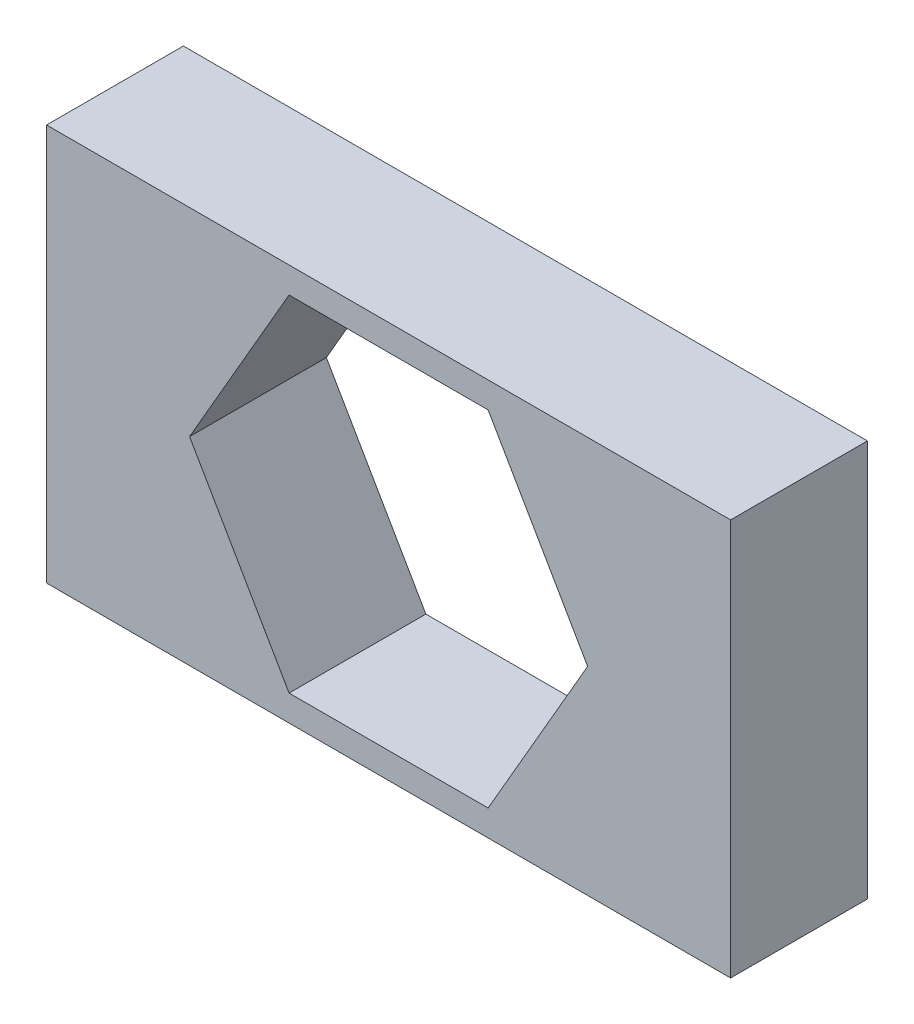
ISO-10303-21;
HEADER;
FILE_DESCRIPTION(('STEP AP214'),'2;1');
FILE_NAME('part.step','',(''),(''),'','','');
FILE_SCHEMA(('AUTOMOTIVE_DESIGN { 1 0 10303 214 1 1 1 1 }'));
ENDSEC;
DATA;
#1=APPLICATION_CONTEXT('core data for automotive mechanical design processes');
#2=APPLICATION_PROTOCOL_DEFINITION('international standard','automotive_design',2000,#1);
#3=PRODUCT_CONTEXT('',#1,'mechanical');
#4=PRODUCT('Part','Part','',(#3));
#5=PRODUCT_RELATED_PRODUCT_CATEGORY('part','',(#4));
#6=PRODUCT_DEFINITION_FORMATION('','',#4);
#7=PRODUCT_DEFINITION_CONTEXT('part definition',#1,'design');
#8=PRODUCT_DEFINITION('design','',#6,#7);
#9=PRODUCT_DEFINITION_SHAPE('','',#8);
#10=(LENGTH_UNIT() NAMED_UNIT(*) SI_UNIT(.MILLI.,.METRE.));
#11=(NAMED_UNIT(*) PLANE_ANGLE_UNIT() SI_UNIT($,.RADIAN.));
#12=(NAMED_UNIT(*) SI_UNIT($,.STERADIAN.) SOLID_ANGLE_UNIT());
#13=UNCERTAINTY_MEASURE_WITH_UNIT(LENGTH_MEASURE(1.E-05),#10,'distance_accuracy_value','');
#14=(GEOMETRIC_REPRESENTATION_CONTEXT(3) GLOBAL_UNCERTAINTY_ASSIGNED_CONTEXT((#13)) GLOBAL_UNIT_ASSIGNED_CONTEXT((#10,
#11,#12)) REPRESENTATION_CONTEXT('',''));
#15=CARTESIAN_POINT('',(0.,0.,0.));
#16=DIRECTION('',(0.,0.,1.));
#17=DIRECTION('',(1.,0.,0.));
#18=AXIS2_PLACEMENT_3D('',#15,#16,#17);
#19=CARTESIAN_POINT('',(0.,0.,5.));
#20=DIRECTION('',(0.,0.,-1.));
#21=DIRECTION('',(-1.,0.,0.));
#22=AXIS2_PLACEMENT_3D('',#19,#20,#21);
#23=PLANE('',#22);
#24=DIRECTION('',(0.,-1.,0.));
#25=VECTOR('',#24,1.);
#26=CARTESIAN_POINT('',(0.,0.,5.));
#27=LINE('',#26,#25);
#28=CARTESIAN_POINT('',(0.,14.5,5.));
#29=VERTEX_POINT('',#28);
#30=CARTESIAN_POINT('',(0.,0.,5.));
#31=VERTEX_POINT('',#30);
#32=EDGE_CURVE('E160',#29,#31,#27,.T.);
#33=ORIENTED_EDGE('',*,*,#32,.T.);
#34=DIRECTION('',(1.,0.,0.));
#35=VECTOR('',#34,1.);
#36=CARTESIAN_POINT('',(0.,0.,5.));
#37=LINE('',#36,#35);
#38=CARTESIAN_POINT('',(25.,0.,5.));
#39=VERTEX_POINT('',#38);
#40=EDGE_CURVE('E163',#31,#39,#37,.T.);
#41=ORIENTED_EDGE('',*,*,#40,.T.);
#42=DIRECTION('',(0.,1.,0.));
#43=VECTOR('',#42,1.);
#44=CARTESIAN_POINT('',(25.,0.,5.));
#45=LINE('',#44,#43);
#46=CARTESIAN_POINT('',(25.,14.5,5.));
#47=VERTEX_POINT('',#46);
#48=EDGE_CURVE('E166',#39,#47,#45,.T.);
#49=ORIENTED_EDGE('',*,*,#48,.T.);
#50=DIRECTION('',(-1.,0.,0.));
#51=VECTOR('',#50,1.);
#52=CARTESIAN_POINT('',(0.,14.5,5.));
#53=LINE('',#52,#51);
#54=EDGE_CURVE('E168',#47,#29,#53,.T.);
#55=ORIENTED_EDGE('',*,*,#54,.T.);
#56=EDGE_LOOP('',(#33,#41,#49,#55));
#57=FACE_BOUND('',#56,.T.);
#58=DIRECTION('',(0.5,0.866025403784439,0.));
#59=VECTOR('',#58,1.);
#60=CARTESIAN_POINT('',(16.1373066958946,0.949999999999999,5.));
#61=LINE('',#60,#59);
#62=CARTESIAN_POINT('',(16.1373066958946,0.949999999999999,5.));
#63=VERTEX_POINT('',#62);
#64=CARTESIAN_POINT('',(19.7746133917893,7.25,5.));
#65=VERTEX_POINT('',#64);
#66=EDGE_CURVE('E109',#63,#65,#61,.T.);
#67=ORIENTED_EDGE('',*,*,#66,.F.);
#68=DIRECTION('',(1.,0.,0.));
#69=VECTOR('',#68,1.);
#70=CARTESIAN_POINT('',(8.86269330410535,0.950000000000003,5.));
#71=LINE('',#70,#69);
#72=CARTESIAN_POINT('',(8.86269330410535,0.950000000000003,5.));
#73=VERTEX_POINT('',#72);
#74=EDGE_CURVE('E138',#73,#63,#71,.T.);
#75=ORIENTED_EDGE('',*,*,#74,.F.);
#76=DIRECTION('',(0.5,-0.866025403784439,0.));
#77=VECTOR('',#76,1.);
#78=CARTESIAN_POINT('',(5.22538660821071,7.25000000000001,5.));
#79=LINE('',#78,#77);
#80=CARTESIAN_POINT('',(5.22538660821071,7.25000000000001,5.));
#81=VERTEX_POINT('',#80);
#82=EDGE_CURVE('E136',#81,#73,#79,.T.);
#83=ORIENTED_EDGE('',*,*,#82,.F.);
#84=DIRECTION('',(-0.5,-0.866025403784438,0.));
#85=VECTOR('',#84,1.);
#86=CARTESIAN_POINT('',(8.86269330410536,13.55,5.));
#87=LINE('',#86,#85);
#88=CARTESIAN_POINT('',(8.86269330410536,13.55,5.));
#89=VERTEX_POINT('',#88);
#90=EDGE_CURVE('E132',#89,#81,#87,.T.);
#91=ORIENTED_EDGE('',*,*,#90,.F.);
#92=DIRECTION('',(-1.,0.,0.));
#93=VECTOR('',#92,1.);
#94=CARTESIAN_POINT('',(16.1373066958946,13.55,5.));
#95=LINE('',#94,#93);
#96=CARTESIAN_POINT('',(16.1373066958946,13.55,5.));
#97=VERTEX_POINT('',#96);
#98=EDGE_CURVE('E130',#97,#89,#95,.T.);
#99=ORIENTED_EDGE('',*,*,#98,.F.);
#100=DIRECTION('',(-0.5,0.866025403784439,0.));
#101=VECTOR('',#100,1.);
#102=CARTESIAN_POINT('',(19.7746133917893,7.25,5.));
#103=LINE('',#102,#101);
#104=EDGE_CURVE('E117',#65,#97,#103,.T.);
#105=ORIENTED_EDGE('',*,*,#104,.F.);
#106=EDGE_LOOP('',(#67,#75,#83,#91,#99,#105));
#107=FACE_BOUND('',#106,.T.);
#108=ADVANCED_FACE('F32',(#57,#107),#23,.F.);
#109=CARTESIAN_POINT('',(0.,0.,0.));
#110=DIRECTION('',(0.,0.,-1.));
#111=DIRECTION('',(-1.,0.,0.));
#112=AXIS2_PLACEMENT_3D('',#109,#110,#111);
#113=PLANE('',#112);
#114=DIRECTION('',(0.,-1.,0.));
#115=VECTOR('',#114,1.);
#116=CARTESIAN_POINT('',(0.,0.,0.));
#117=LINE('',#116,#115);
#118=CARTESIAN_POINT('',(0.,14.5,0.));
#119=VERTEX_POINT('',#118);
#120=CARTESIAN_POINT('',(0.,0.,0.));
#121=VERTEX_POINT('',#120);
#122=EDGE_CURVE('E125',#119,#121,#117,.T.);
#123=ORIENTED_EDGE('',*,*,#122,.F.);
#124=DIRECTION('',(-1.,0.,0.));
#125=VECTOR('',#124,1.);
#126=CARTESIAN_POINT('',(0.,14.5,0.));
#127=LINE('',#126,#125);
#128=CARTESIAN_POINT('',(25.,14.5,0.));
#129=VERTEX_POINT('',#128);
#130=EDGE_CURVE('E164',#129,#119,#127,.T.);
#131=ORIENTED_EDGE('',*,*,#130,.F.);
#132=DIRECTION('',(0.,1.,0.));
#133=VECTOR('',#132,1.);
#134=CARTESIAN_POINT('',(25.,0.,0.));
#135=LINE('',#134,#133);
#136=CARTESIAN_POINT('',(25.,0.,0.));
#137=VERTEX_POINT('',#136);
#138=EDGE_CURVE('E175',#137,#129,#135,.T.);
#139=ORIENTED_EDGE('',*,*,#138,.F.);
#140=DIRECTION('',(1.,0.,0.));
#141=VECTOR('',#140,1.);
#142=CARTESIAN_POINT('',(0.,0.,0.));
#143=LINE('',#142,#141);
#144=EDGE_CURVE('E173',#121,#137,#143,.T.);
#145=ORIENTED_EDGE('',*,*,#144,.F.);
#146=EDGE_LOOP('',(#123,#131,#139,#145));
#147=FACE_BOUND('',#146,.T.);
#148=DIRECTION('',(1.,0.,0.));
#149=VECTOR('',#148,1.);
#150=CARTESIAN_POINT('',(8.86269330410535,0.950000000000003,0.));
#151=LINE('',#150,#149);
#152=CARTESIAN_POINT('',(8.86269330410535,0.950000000000003,0.));
#153=VERTEX_POINT('',#152);
#154=CARTESIAN_POINT('',(16.1373066958946,0.949999999999999,0.));
#155=VERTEX_POINT('',#154);
#156=EDGE_CURVE('E118',#153,#155,#151,.T.);
#157=ORIENTED_EDGE('',*,*,#156,.T.);
#158=DIRECTION('',(0.5,0.866025403784439,0.));
#159=VECTOR('',#158,1.);
#160=CARTESIAN_POINT('',(16.1373066958946,0.949999999999999,0.));
#161=LINE('',#160,#159);
#162=CARTESIAN_POINT('',(19.7746133917893,7.25,0.));
#163=VERTEX_POINT('',#162);
#164=EDGE_CURVE('E55',#155,#163,#161,.T.);
#165=ORIENTED_EDGE('',*,*,#164,.T.);
#166=DIRECTION('',(-0.5,0.866025403784439,0.));
#167=VECTOR('',#166,1.);
#168=CARTESIAN_POINT('',(19.7746133917893,7.25,0.));
#169=LINE('',#168,#167);
#170=CARTESIAN_POINT('',(16.1373066958946,13.55,0.));
#171=VERTEX_POINT('',#170);
#172=EDGE_CURVE('E124',#163,#171,#169,.T.);
#173=ORIENTED_EDGE('',*,*,#172,.T.);
#174=DIRECTION('',(-1.,0.,0.));
#175=VECTOR('',#174,1.);
#176=CARTESIAN_POINT('',(16.1373066958946,13.55,0.));
#177=LINE('',#176,#175);
#178=CARTESIAN_POINT('',(8.86269330410536,13.55,0.));
#179=VERTEX_POINT('',#178);
#180=EDGE_CURVE('E142',#171,#179,#177,.T.);
#181=ORIENTED_EDGE('',*,*,#180,.T.);
#182=DIRECTION('',(-0.5,-0.866025403784438,0.));
#183=VECTOR('',#182,1.);
#184=CARTESIAN_POINT('',(8.86269330410536,13.55,0.));
#185=LINE('',#184,#183);
#186=CARTESIAN_POINT('',(5.22538660821071,7.25000000000001,0.));
#187=VERTEX_POINT('',#186);
#188=EDGE_CURVE('E145',#179,#187,#185,.T.);
#189=ORIENTED_EDGE('',*,*,#188,.T.);
#190=DIRECTION('',(0.5,-0.866025403784439,0.));
#191=VECTOR('',#190,1.);
#192=CARTESIAN_POINT('',(5.22538660821071,7.25000000000001,0.));
#193=LINE('',#192,#191);
#194=EDGE_CURVE('E148',#187,#153,#193,.T.);
#195=ORIENTED_EDGE('',*,*,#194,.T.);
#196=EDGE_LOOP('',(#157,#165,#173,#181,#189,#195));
#197=FACE_BOUND('',#196,.T.);
#198=ADVANCED_FACE('F193',(#147,#197),#113,.T.);
#199=CARTESIAN_POINT('',(0.,0.,5.));
#200=DIRECTION('',(1.,0.,0.));
#201=DIRECTION('',(0.,1.,0.));
#202=AXIS2_PLACEMENT_3D('',#199,#200,#201);
#203=PLANE('',#202);
#204=ORIENTED_EDGE('',*,*,#122,.T.);
#205=DIRECTION('',(0.,0.,-1.));
#206=VECTOR('',#205,1.);
#207=CARTESIAN_POINT('',(0.,0.,5.));
#208=LINE('',#207,#206);
#209=EDGE_CURVE('E11',#31,#121,#208,.T.);
#210=ORIENTED_EDGE('',*,*,#209,.F.);
#211=ORIENTED_EDGE('',*,*,#32,.F.);
#212=DIRECTION('',(0.,0.,-1.));
#213=VECTOR('',#212,1.);
#214=CARTESIAN_POINT('',(0.,14.5,5.));
#215=LINE('',#214,#213);
#216=EDGE_CURVE('E170',#29,#119,#215,.T.);
#217=ORIENTED_EDGE('',*,*,#216,.T.);
#218=EDGE_LOOP('',(#204,#210,#211,#217));
#219=FACE_BOUND('',#218,.T.);
#220=ADVANCED_FACE('F34',(#219),#203,.F.);
#221=CARTESIAN_POINT('',(0.,0.,5.));
#222=DIRECTION('',(0.,1.,0.));
#223=DIRECTION('',(-1.,0.,0.));
#224=AXIS2_PLACEMENT_3D('',#221,#222,#223);
#225=PLANE('',#224);
#226=ORIENTED_EDGE('',*,*,#144,.T.);
#227=DIRECTION('',(0.,0.,-1.));
#228=VECTOR('',#227,1.);
#229=CARTESIAN_POINT('',(25.,0.,5.));
#230=LINE('',#229,#228);
#231=EDGE_CURVE('E40',#39,#137,#230,.T.);
#232=ORIENTED_EDGE('',*,*,#231,.F.);
#233=ORIENTED_EDGE('',*,*,#40,.F.);
#234=ORIENTED_EDGE('',*,*,#209,.T.);
#235=EDGE_LOOP('',(#226,#232,#233,#234));
#236=FACE_BOUND('',#235,.T.);
#237=ADVANCED_FACE('F203',(#236),#225,.F.);
#238=CARTESIAN_POINT('',(25.,0.,5.));
#239=DIRECTION('',(-1.,0.,0.));
#240=DIRECTION('',(0.,0.,1.));
#241=AXIS2_PLACEMENT_3D('',#238,#239,#240);
#242=PLANE('',#241);
#243=ORIENTED_EDGE('',*,*,#138,.T.);
#244=DIRECTION('',(0.,0.,-1.));
#245=VECTOR('',#244,1.);
#246=CARTESIAN_POINT('',(25.,14.5,5.));
#247=LINE('',#246,#245);
#248=EDGE_CURVE('E180',#47,#129,#247,.T.);
#249=ORIENTED_EDGE('',*,*,#248,.F.);
#250=ORIENTED_EDGE('',*,*,#48,.F.);
#251=ORIENTED_EDGE('',*,*,#231,.T.);
#252=EDGE_LOOP('',(#243,#249,#250,#251));
#253=FACE_BOUND('',#252,.T.);
#254=ADVANCED_FACE('F187',(#253),#242,.F.);
#255=CARTESIAN_POINT('',(0.,14.5,5.));
#256=DIRECTION('',(0.,-1.,0.));
#257=DIRECTION('',(0.,0.,-1.));
#258=AXIS2_PLACEMENT_3D('',#255,#256,#257);
#259=PLANE('',#258);
#260=ORIENTED_EDGE('',*,*,#130,.T.);
#261=ORIENTED_EDGE('',*,*,#216,.F.);
#262=ORIENTED_EDGE('',*,*,#54,.F.);
#263=ORIENTED_EDGE('',*,*,#248,.T.);
#264=EDGE_LOOP('',(#260,#261,#262,#263));
#265=FACE_BOUND('',#264,.T.);
#266=ADVANCED_FACE('F197',(#265),#259,.F.);
#267=CARTESIAN_POINT('',(16.1373066958946,0.949999999999999,5.));
#268=DIRECTION('',(-0.866025403784439,0.5,0.));
#269=DIRECTION('',(-0.5,-0.866025403784439,0.));
#270=AXIS2_PLACEMENT_3D('',#267,#268,#269);
#271=PLANE('',#270);
#272=ORIENTED_EDGE('',*,*,#164,.F.);
#273=DIRECTION('',(0.,0.,-1.));
#274=VECTOR('',#273,1.);
#275=CARTESIAN_POINT('',(16.1373066958946,0.949999999999999,5.));
#276=LINE('',#275,#274);
#277=EDGE_CURVE('E113',#63,#155,#276,.T.);
#278=ORIENTED_EDGE('',*,*,#277,.F.);
#279=ORIENTED_EDGE('',*,*,#66,.T.);
#280=DIRECTION('',(0.,0.,-1.));
#281=VECTOR('',#280,1.);
#282=CARTESIAN_POINT('',(19.7746133917893,7.25,5.));
#283=LINE('',#282,#281);
#284=EDGE_CURVE('E112',#65,#163,#283,.T.);
#285=ORIENTED_EDGE('',*,*,#284,.T.);
#286=EDGE_LOOP('',(#272,#278,#279,#285));
#287=FACE_BOUND('',#286,.T.);
#288=ADVANCED_FACE('F111',(#287),#271,.T.);
#289=CARTESIAN_POINT('',(19.7746133917893,7.25,5.));
#290=DIRECTION('',(-0.866025403784439,-0.5,0.));
#291=DIRECTION('',(0.5,-0.866025403784439,0.));
#292=AXIS2_PLACEMENT_3D('',#289,#290,#291);
#293=PLANE('',#292);
#294=ORIENTED_EDGE('',*,*,#172,.F.);
#295=ORIENTED_EDGE('',*,*,#284,.F.);
#296=ORIENTED_EDGE('',*,*,#104,.T.);
#297=DIRECTION('',(0.,0.,-1.));
#298=VECTOR('',#297,1.);
#299=CARTESIAN_POINT('',(16.1373066958946,13.55,5.));
#300=LINE('',#299,#298);
#301=EDGE_CURVE('E126',#97,#171,#300,.T.);
#302=ORIENTED_EDGE('',*,*,#301,.T.);
#303=EDGE_LOOP('',(#294,#295,#296,#302));
#304=FACE_BOUND('',#303,.T.);
#305=ADVANCED_FACE('F121',(#304),#293,.T.);
#306=CARTESIAN_POINT('',(16.1373066958946,13.55,5.));
#307=DIRECTION('',(0.,-1.,0.));
#308=DIRECTION('',(1.,0.,0.));
#309=AXIS2_PLACEMENT_3D('',#306,#307,#308);
#310=PLANE('',#309);
#311=ORIENTED_EDGE('',*,*,#180,.F.);
#312=ORIENTED_EDGE('',*,*,#301,.F.);
#313=ORIENTED_EDGE('',*,*,#98,.T.);
#314=DIRECTION('',(0.,0.,-1.));
#315=VECTOR('',#314,1.);
#316=CARTESIAN_POINT('',(8.86269330410536,13.55,5.));
#317=LINE('',#316,#315);
#318=EDGE_CURVE('E157',#89,#179,#317,.T.);
#319=ORIENTED_EDGE('',*,*,#318,.T.);
#320=EDGE_LOOP('',(#311,#312,#313,#319));
#321=FACE_BOUND('',#320,.T.);
#322=ADVANCED_FACE('F226',(#321),#310,.T.);
#323=CARTESIAN_POINT('',(8.86269330410536,13.55,5.));
#324=DIRECTION('',(0.866025403784439,-0.5,0.));
#325=DIRECTION('',(0.5,0.866025403784439,0.));
#326=AXIS2_PLACEMENT_3D('',#323,#324,#325);
#327=PLANE('',#326);
#328=ORIENTED_EDGE('',*,*,#188,.F.);
#329=ORIENTED_EDGE('',*,*,#318,.F.);
#330=ORIENTED_EDGE('',*,*,#90,.T.);
#331=DIRECTION('',(0.,0.,-1.));
#332=VECTOR('',#331,1.);
#333=CARTESIAN_POINT('',(5.22538660821071,7.25000000000001,5.));
#334=LINE('',#333,#332);
#335=EDGE_CURVE('E155',#81,#187,#334,.T.);
#336=ORIENTED_EDGE('',*,*,#335,.T.);
#337=EDGE_LOOP('',(#328,#329,#330,#336));
#338=FACE_BOUND('',#337,.T.);
#339=ADVANCED_FACE('F230',(#338),#327,.T.);
#340=CARTESIAN_POINT('',(5.22538660821071,7.25000000000001,5.));
#341=DIRECTION('',(0.866025403784439,0.5,0.));
#342=DIRECTION('',(-0.5,0.866025403784439,0.));
#343=AXIS2_PLACEMENT_3D('',#340,#341,#342);
#344=PLANE('',#343);
#345=ORIENTED_EDGE('',*,*,#194,.F.);
#346=ORIENTED_EDGE('',*,*,#335,.F.);
#347=ORIENTED_EDGE('',*,*,#82,.T.);
#348=DIRECTION('',(0.,0.,-1.));
#349=VECTOR('',#348,1.);
#350=CARTESIAN_POINT('',(8.86269330410535,0.950000000000003,5.));
#351=LINE('',#350,#349);
#352=EDGE_CURVE('E47',#73,#153,#351,.T.);
#353=ORIENTED_EDGE('',*,*,#352,.T.);
#354=EDGE_LOOP('',(#345,#346,#347,#353));
#355=FACE_BOUND('',#354,.T.);
#356=ADVANCED_FACE('F236',(#355),#344,.T.);
#357=CARTESIAN_POINT('',(8.86269330410535,0.950000000000003,5.));
#358=DIRECTION('',(0.,1.,0.));
#359=DIRECTION('',(-1.,0.,0.));
#360=AXIS2_PLACEMENT_3D('',#357,#358,#359);
#361=PLANE('',#360);
#362=ORIENTED_EDGE('',*,*,#156,.F.);
#363=ORIENTED_EDGE('',*,*,#352,.F.);
#364=ORIENTED_EDGE('',*,*,#74,.T.);
#365=ORIENTED_EDGE('',*,*,#277,.T.);
#366=EDGE_LOOP('',(#362,#363,#364,#365));
#367=FACE_BOUND('',#366,.T.);
#368=ADVANCED_FACE('F240',(#367),#361,.T.);
#369=CLOSED_SHELL('',(#108,#198,#220,#237,#254,#266,#288,#305,#322,#339,#356,#368));
#370=MANIFOLD_SOLID_BREP('B2',#369);
#371=ADVANCED_BREP_SHAPE_REPRESENTATION('',(#18,#370),#14);
#372=SHAPE_DEFINITION_REPRESENTATION(#9,#371);
ENDSEC;
END-ISO-10303-21;
